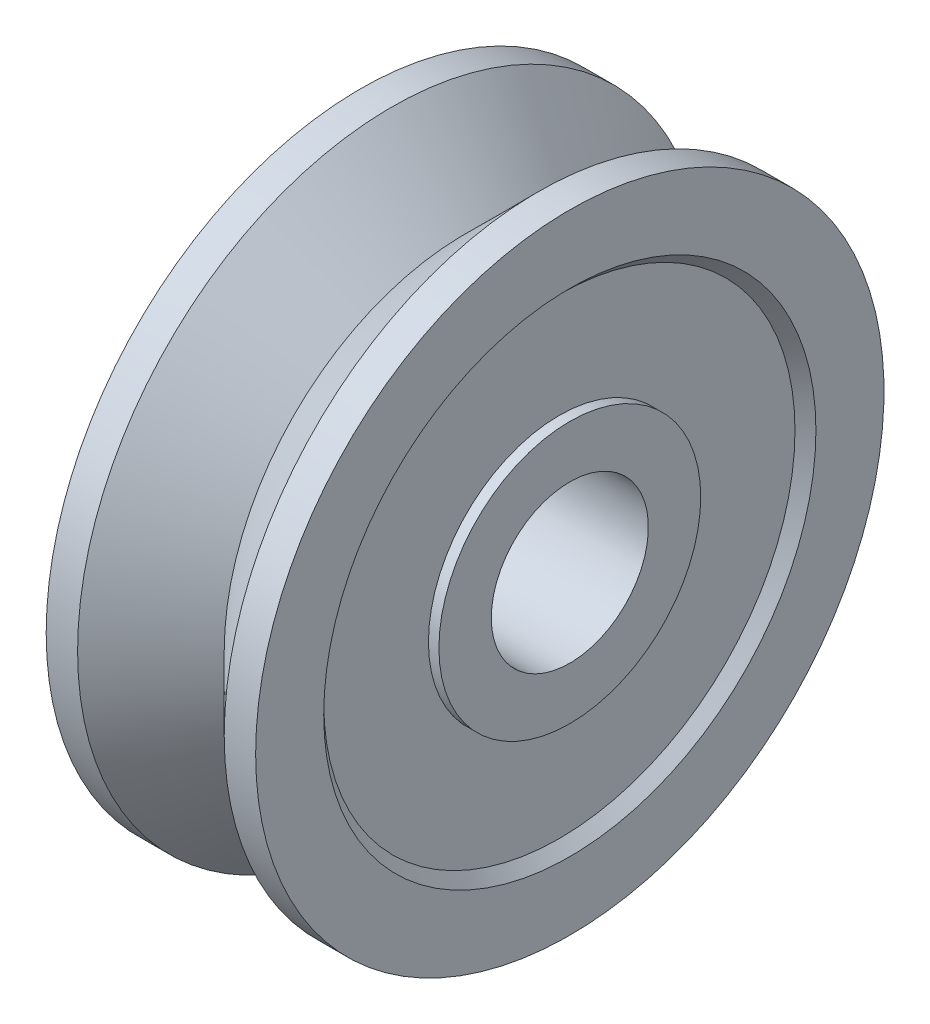
ISO-10303-21;
HEADER;
FILE_DESCRIPTION(('STEP AP214'),'2;1');
FILE_NAME('part.step','',(''),(''),'','','');
FILE_SCHEMA(('AUTOMOTIVE_DESIGN { 1 0 10303 214 1 1 1 1 }'));
ENDSEC;
DATA;
#1=APPLICATION_CONTEXT('core data for automotive mechanical design processes');
#2=APPLICATION_PROTOCOL_DEFINITION('international standard','automotive_design',2000,#1);
#3=PRODUCT_CONTEXT('',#1,'mechanical');
#4=PRODUCT('Part','Part','',(#3));
#5=PRODUCT_RELATED_PRODUCT_CATEGORY('part','',(#4));
#6=PRODUCT_DEFINITION_FORMATION('','',#4);
#7=PRODUCT_DEFINITION_CONTEXT('part definition',#1,'design');
#8=PRODUCT_DEFINITION('design','',#6,#7);
#9=PRODUCT_DEFINITION_SHAPE('','',#8);
#10=(LENGTH_UNIT() NAMED_UNIT(*) SI_UNIT(.MILLI.,.METRE.));
#11=(NAMED_UNIT(*) PLANE_ANGLE_UNIT() SI_UNIT($,.RADIAN.));
#12=(NAMED_UNIT(*) SI_UNIT($,.STERADIAN.) SOLID_ANGLE_UNIT());
#13=UNCERTAINTY_MEASURE_WITH_UNIT(LENGTH_MEASURE(1.E-05),#10,'distance_accuracy_value','');
#14=(GEOMETRIC_REPRESENTATION_CONTEXT(3) GLOBAL_UNCERTAINTY_ASSIGNED_CONTEXT((#13)) GLOBAL_UNIT_ASSIGNED_CONTEXT((#10,
#11,#12)) REPRESENTATION_CONTEXT('',''));
#15=CARTESIAN_POINT('',(0.,0.,0.));
#16=DIRECTION('',(0.,0.,1.));
#17=DIRECTION('',(1.,0.,0.));
#18=AXIS2_PLACEMENT_3D('',#15,#16,#17);
#19=CARTESIAN_POINT('',(-2.,1.5,0.));
#20=DIRECTION('',(1.,0.,0.));
#21=DIRECTION('',(0.,0.,-1.));
#22=AXIS2_PLACEMENT_3D('',#19,#20,#21);
#23=PLANE('',#22);
#24=CARTESIAN_POINT('',(-2.,0.,0.));
#25=DIRECTION('',(-1.,0.,0.));
#26=DIRECTION('',(0.,0.,1.));
#27=AXIS2_PLACEMENT_3D('',#24,#25,#26);
#28=CIRCLE('',#27,1.5);
#29=CARTESIAN_POINT('',(-2.,0.,1.5));
#30=VERTEX_POINT('',#29);
#31=EDGE_CURVE('E44',#30,#30,#28,.T.);
#32=ORIENTED_EDGE('',*,*,#31,.F.);
#33=EDGE_LOOP('',(#32));
#34=FACE_BOUND('',#33,.T.);
#35=CARTESIAN_POINT('',(-2.,0.,0.));
#36=DIRECTION('',(-1.,0.,0.));
#37=DIRECTION('',(0.,0.,1.));
#38=AXIS2_PLACEMENT_3D('',#35,#36,#37);
#39=CIRCLE('',#38,2.5);
#40=CARTESIAN_POINT('',(-2.,0.,2.5));
#41=VERTEX_POINT('',#40);
#42=EDGE_CURVE('E81',#41,#41,#39,.T.);
#43=ORIENTED_EDGE('',*,*,#42,.T.);
#44=EDGE_LOOP('',(#43));
#45=FACE_BOUND('',#44,.T.);
#46=ADVANCED_FACE('F33',(#34,#45),#23,.F.);
#47=CARTESIAN_POINT('',(2.,6.,0.));
#48=DIRECTION('',(-1.,0.,0.));
#49=DIRECTION('',(0.,0.,1.));
#50=AXIS2_PLACEMENT_3D('',#47,#48,#49);
#51=PLANE('',#50);
#52=CARTESIAN_POINT('',(2.,0.,0.));
#53=DIRECTION('',(-1.,0.,0.));
#54=DIRECTION('',(0.,0.,1.));
#55=AXIS2_PLACEMENT_3D('',#52,#53,#54);
#56=CIRCLE('',#55,1.5);
#57=CARTESIAN_POINT('',(2.,0.,1.5));
#58=VERTEX_POINT('',#57);
#59=EDGE_CURVE('E65',#58,#58,#56,.T.);
#60=ORIENTED_EDGE('',*,*,#59,.T.);
#61=EDGE_LOOP('',(#60));
#62=FACE_BOUND('',#61,.T.);
#63=CARTESIAN_POINT('',(2.,0.,0.));
#64=DIRECTION('',(1.,0.,0.));
#65=DIRECTION('',(0.,0.,-1.));
#66=AXIS2_PLACEMENT_3D('',#63,#64,#65);
#67=CIRCLE('',#66,2.5);
#68=CARTESIAN_POINT('',(2.,0.,-2.5));
#69=VERTEX_POINT('',#68);
#70=EDGE_CURVE('E72',#69,#69,#67,.T.);
#71=ORIENTED_EDGE('',*,*,#70,.T.);
#72=EDGE_LOOP('',(#71));
#73=FACE_BOUND('',#72,.T.);
#74=ADVANCED_FACE('F104',(#62,#73),#51,.F.);
#75=CARTESIAN_POINT('',(-2.,0.,0.));
#76=DIRECTION('',(-1.,0.,0.));
#77=DIRECTION('',(0.,0.,1.));
#78=AXIS2_PLACEMENT_3D('',#75,#76,#77);
#79=CYLINDRICAL_SURFACE('',#78,1.5);
#80=ORIENTED_EDGE('',*,*,#59,.F.);
#81=EDGE_LOOP('',(#80));
#82=FACE_BOUND('',#81,.T.);
#83=ORIENTED_EDGE('',*,*,#31,.T.);
#84=EDGE_LOOP('',(#83));
#85=FACE_BOUND('',#84,.T.);
#86=ADVANCED_FACE('F113',(#82,#85),#79,.F.);
#87=CARTESIAN_POINT('',(-2.,0.,0.));
#88=DIRECTION('',(1.,0.,0.));
#89=DIRECTION('',(0.,0.,-1.));
#90=AXIS2_PLACEMENT_3D('',#87,#88,#89);
#91=CIRCLE('',#90,4.7);
#92=CARTESIAN_POINT('',(-2.,0.,-4.7));
#93=VERTEX_POINT('',#92);
#94=EDGE_CURVE('E10',#93,#93,#91,.T.);
#95=ORIENTED_EDGE('',*,*,#94,.T.);
#96=EDGE_LOOP('',(#95));
#97=FACE_BOUND('',#96,.T.);
#98=CARTESIAN_POINT('',(-2.,0.,0.));
#99=DIRECTION('',(-1.,0.,0.));
#100=DIRECTION('',(0.,0.,1.));
#101=AXIS2_PLACEMENT_3D('',#98,#99,#100);
#102=CIRCLE('',#101,6.);
#103=CARTESIAN_POINT('',(-2.,0.,6.));
#104=VERTEX_POINT('',#103);
#105=EDGE_CURVE('E48',#104,#104,#102,.T.);
#106=ORIENTED_EDGE('',*,*,#105,.T.);
#107=EDGE_LOOP('',(#106));
#108=FACE_BOUND('',#107,.T.);
#109=ADVANCED_FACE('F107',(#97,#108),#23,.F.);
#110=CARTESIAN_POINT('',(-2.,0.,0.));
#111=DIRECTION('',(-1.,0.,0.));
#112=DIRECTION('',(0.,0.,1.));
#113=AXIS2_PLACEMENT_3D('',#110,#111,#112);
#114=CYLINDRICAL_SURFACE('',#113,6.);
#115=ORIENTED_EDGE('',*,*,#105,.F.);
#116=EDGE_LOOP('',(#115));
#117=FACE_BOUND('',#116,.T.);
#118=CARTESIAN_POINT('',(-1.4,0.,0.));
#119=DIRECTION('',(-1.,0.,0.));
#120=DIRECTION('',(0.,0.,1.));
#121=AXIS2_PLACEMENT_3D('',#118,#119,#120);
#122=CIRCLE('',#121,6.);
#123=CARTESIAN_POINT('',(-1.4,0.,6.));
#124=VERTEX_POINT('',#123);
#125=EDGE_CURVE('E53',#124,#124,#122,.T.);
#126=ORIENTED_EDGE('',*,*,#125,.T.);
#127=EDGE_LOOP('',(#126));
#128=FACE_BOUND('',#127,.T.);
#129=ADVANCED_FACE('F122',(#117,#128),#114,.T.);
#130=CARTESIAN_POINT('',(0.,0.,0.));
#131=DIRECTION('',(-1.,0.,0.));
#132=DIRECTION('',(0.,0.,1.));
#133=AXIS2_PLACEMENT_3D('',#130,#131,#132);
#134=CONICAL_SURFACE('',#133,4.6,0.785398163397449);
#135=ORIENTED_EDGE('',*,*,#125,.F.);
#136=EDGE_LOOP('',(#135));
#137=FACE_BOUND('',#136,.T.);
#138=CARTESIAN_POINT('',(0.,0.,0.));
#139=DIRECTION('',(-1.,0.,0.));
#140=DIRECTION('',(0.,0.,1.));
#141=AXIS2_PLACEMENT_3D('',#138,#139,#140);
#142=CIRCLE('',#141,4.6);
#143=CARTESIAN_POINT('',(0.,0.,4.6));
#144=VERTEX_POINT('',#143);
#145=EDGE_CURVE('E56',#144,#144,#142,.T.);
#146=ORIENTED_EDGE('',*,*,#145,.T.);
#147=EDGE_LOOP('',(#146));
#148=FACE_BOUND('',#147,.T.);
#149=ADVANCED_FACE('F127',(#137,#148),#134,.T.);
#150=CARTESIAN_POINT('',(1.4,0.,0.));
#151=DIRECTION('',(1.,0.,0.));
#152=DIRECTION('',(0.,0.,-1.));
#153=AXIS2_PLACEMENT_3D('',#150,#151,#152);
#154=CONICAL_SURFACE('',#153,6.,0.785398163397449);
#155=ORIENTED_EDGE('',*,*,#145,.F.);
#156=EDGE_LOOP('',(#155));
#157=FACE_BOUND('',#156,.T.);
#158=CARTESIAN_POINT('',(1.4,0.,0.));
#159=DIRECTION('',(-1.,0.,0.));
#160=DIRECTION('',(0.,0.,1.));
#161=AXIS2_PLACEMENT_3D('',#158,#159,#160);
#162=CIRCLE('',#161,6.);
#163=CARTESIAN_POINT('',(1.4,0.,6.));
#164=VERTEX_POINT('',#163);
#165=EDGE_CURVE('E59',#164,#164,#162,.T.);
#166=ORIENTED_EDGE('',*,*,#165,.T.);
#167=EDGE_LOOP('',(#166));
#168=FACE_BOUND('',#167,.T.);
#169=ADVANCED_FACE('F138',(#157,#168),#154,.T.);
#170=CARTESIAN_POINT('',(-2.,0.,0.));
#171=DIRECTION('',(-1.,0.,0.));
#172=DIRECTION('',(0.,0.,1.));
#173=AXIS2_PLACEMENT_3D('',#170,#171,#172);
#174=CYLINDRICAL_SURFACE('',#173,6.);
#175=ORIENTED_EDGE('',*,*,#165,.F.);
#176=EDGE_LOOP('',(#175));
#177=FACE_BOUND('',#176,.T.);
#178=CARTESIAN_POINT('',(2.,0.,0.));
#179=DIRECTION('',(-1.,0.,0.));
#180=DIRECTION('',(0.,0.,1.));
#181=AXIS2_PLACEMENT_3D('',#178,#179,#180);
#182=CIRCLE('',#181,6.);
#183=CARTESIAN_POINT('',(2.,0.,6.));
#184=VERTEX_POINT('',#183);
#185=EDGE_CURVE('E62',#184,#184,#182,.T.);
#186=ORIENTED_EDGE('',*,*,#185,.T.);
#187=EDGE_LOOP('',(#186));
#188=FACE_BOUND('',#187,.T.);
#189=ADVANCED_FACE('F144',(#177,#188),#174,.T.);
#190=CARTESIAN_POINT('',(2.,0.,0.));
#191=DIRECTION('',(-1.,0.,0.));
#192=DIRECTION('',(0.,0.,1.));
#193=AXIS2_PLACEMENT_3D('',#190,#191,#192);
#194=CIRCLE('',#193,4.7);
#195=CARTESIAN_POINT('',(2.,0.,4.7));
#196=VERTEX_POINT('',#195);
#197=EDGE_CURVE('E40',#196,#196,#194,.T.);
#198=ORIENTED_EDGE('',*,*,#197,.T.);
#199=EDGE_LOOP('',(#198));
#200=FACE_BOUND('',#199,.T.);
#201=ORIENTED_EDGE('',*,*,#185,.F.);
#202=EDGE_LOOP('',(#201));
#203=FACE_BOUND('',#202,.T.);
#204=ADVANCED_FACE('F116',(#200,#203),#51,.F.);
#205=CARTESIAN_POINT('',(1.8,0.,0.));
#206=DIRECTION('',(1.,0.,0.));
#207=DIRECTION('',(0.,0.,-1.));
#208=AXIS2_PLACEMENT_3D('',#205,#206,#207);
#209=PLANE('',#208);
#210=CARTESIAN_POINT('',(1.8,0.,0.));
#211=DIRECTION('',(1.,0.,0.));
#212=DIRECTION('',(0.,0.,-1.));
#213=AXIS2_PLACEMENT_3D('',#210,#211,#212);
#214=CIRCLE('',#213,2.5);
#215=CARTESIAN_POINT('',(1.8,0.,-2.5));
#216=VERTEX_POINT('',#215);
#217=EDGE_CURVE('E71',#216,#216,#214,.T.);
#218=ORIENTED_EDGE('',*,*,#217,.F.);
#219=EDGE_LOOP('',(#218));
#220=FACE_BOUND('',#219,.T.);
#221=CARTESIAN_POINT('',(1.8,0.,0.));
#222=DIRECTION('',(1.,0.,0.));
#223=DIRECTION('',(0.,0.,-1.));
#224=AXIS2_PLACEMENT_3D('',#221,#222,#223);
#225=CIRCLE('',#224,4.5);
#226=CARTESIAN_POINT('',(1.8,0.,-4.5));
#227=VERTEX_POINT('',#226);
#228=EDGE_CURVE('E68',#227,#227,#225,.T.);
#229=ORIENTED_EDGE('',*,*,#228,.T.);
#230=EDGE_LOOP('',(#229));
#231=FACE_BOUND('',#230,.T.);
#232=ADVANCED_FACE('F154',(#220,#231),#209,.T.);
#233=CARTESIAN_POINT('',(1.8,0.,0.));
#234=DIRECTION('',(1.,0.,0.));
#235=DIRECTION('',(0.,0.,-1.));
#236=AXIS2_PLACEMENT_3D('',#233,#234,#235);
#237=CYLINDRICAL_SURFACE('',#236,2.5);
#238=ORIENTED_EDGE('',*,*,#217,.T.);
#239=EDGE_LOOP('',(#238));
#240=FACE_BOUND('',#239,.T.);
#241=ORIENTED_EDGE('',*,*,#70,.F.);
#242=EDGE_LOOP('',(#241));
#243=FACE_BOUND('',#242,.T.);
#244=ADVANCED_FACE('F159',(#240,#243),#237,.T.);
#245=CARTESIAN_POINT('',(1.8,0.,0.));
#246=DIRECTION('',(1.,0.,0.));
#247=DIRECTION('',(0.,0.,-1.));
#248=AXIS2_PLACEMENT_3D('',#245,#246,#247);
#249=CONICAL_SURFACE('',#248,4.5,0.785398163397448);
#250=ORIENTED_EDGE('',*,*,#197,.F.);
#251=EDGE_LOOP('',(#250));
#252=FACE_BOUND('',#251,.T.);
#253=ORIENTED_EDGE('',*,*,#228,.F.);
#254=EDGE_LOOP('',(#253));
#255=FACE_BOUND('',#254,.T.);
#256=ADVANCED_FACE('F93',(#252,#255),#249,.F.);
#257=CARTESIAN_POINT('',(-1.8,0.,0.));
#258=DIRECTION('',(-1.,0.,0.));
#259=DIRECTION('',(0.,0.,1.));
#260=AXIS2_PLACEMENT_3D('',#257,#258,#259);
#261=PLANE('',#260);
#262=CARTESIAN_POINT('',(-1.8,0.,0.));
#263=DIRECTION('',(-1.,0.,0.));
#264=DIRECTION('',(0.,0.,1.));
#265=AXIS2_PLACEMENT_3D('',#262,#263,#264);
#266=CIRCLE('',#265,2.5);
#267=CARTESIAN_POINT('',(-1.8,0.,2.5));
#268=VERTEX_POINT('',#267);
#269=EDGE_CURVE('E80',#268,#268,#266,.T.);
#270=ORIENTED_EDGE('',*,*,#269,.F.);
#271=EDGE_LOOP('',(#270));
#272=FACE_BOUND('',#271,.T.);
#273=CARTESIAN_POINT('',(-1.8,0.,0.));
#274=DIRECTION('',(-1.,0.,0.));
#275=DIRECTION('',(0.,0.,1.));
#276=AXIS2_PLACEMENT_3D('',#273,#274,#275);
#277=CIRCLE('',#276,4.5);
#278=CARTESIAN_POINT('',(-1.8,0.,4.5));
#279=VERTEX_POINT('',#278);
#280=EDGE_CURVE('E75',#279,#279,#277,.T.);
#281=ORIENTED_EDGE('',*,*,#280,.T.);
#282=EDGE_LOOP('',(#281));
#283=FACE_BOUND('',#282,.T.);
#284=ADVANCED_FACE('F90',(#272,#283),#261,.T.);
#285=CARTESIAN_POINT('',(-1.8,0.,0.));
#286=DIRECTION('',(-1.,0.,0.));
#287=DIRECTION('',(0.,0.,1.));
#288=AXIS2_PLACEMENT_3D('',#285,#286,#287);
#289=CYLINDRICAL_SURFACE('',#288,2.5);
#290=ORIENTED_EDGE('',*,*,#269,.T.);
#291=EDGE_LOOP('',(#290));
#292=FACE_BOUND('',#291,.T.);
#293=ORIENTED_EDGE('',*,*,#42,.F.);
#294=EDGE_LOOP('',(#293));
#295=FACE_BOUND('',#294,.T.);
#296=ADVANCED_FACE('F87',(#292,#295),#289,.T.);
#297=CARTESIAN_POINT('',(-1.8,0.,0.));
#298=DIRECTION('',(-1.,0.,0.));
#299=DIRECTION('',(0.,0.,1.));
#300=AXIS2_PLACEMENT_3D('',#297,#298,#299);
#301=CONICAL_SURFACE('',#300,4.5,0.785398163397448);
#302=ORIENTED_EDGE('',*,*,#94,.F.);
#303=EDGE_LOOP('',(#302));
#304=FACE_BOUND('',#303,.T.);
#305=ORIENTED_EDGE('',*,*,#280,.F.);
#306=EDGE_LOOP('',(#305));
#307=FACE_BOUND('',#306,.T.);
#308=ADVANCED_FACE('F35',(#304,#307),#301,.F.);
#309=CLOSED_SHELL('',(#46,#74,#86,#109,#129,#149,#169,#189,#204,#232,#244,#256,#284,#296,#308));
#310=MANIFOLD_SOLID_BREP('B2',#309);
#311=ADVANCED_BREP_SHAPE_REPRESENTATION('',(#18,#310),#14);
#312=SHAPE_DEFINITION_REPRESENTATION(#9,#311);
ENDSEC;
END-ISO-10303-21;
